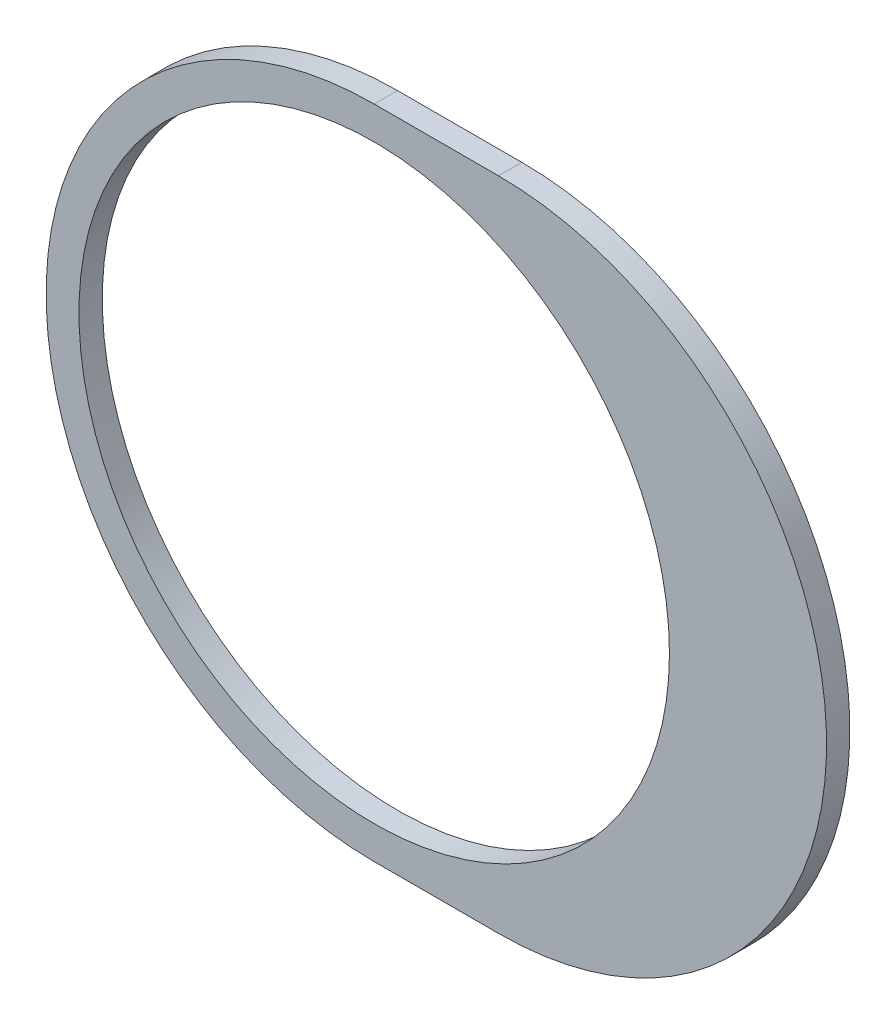
ISO-10303-21;
HEADER;
FILE_DESCRIPTION(('STEP AP214'),'2;1');
FILE_NAME('part.step','',(''),(''),'','','');
FILE_SCHEMA(('AUTOMOTIVE_DESIGN { 1 0 10303 214 1 1 1 1 }'));
ENDSEC;
DATA;
#1=APPLICATION_CONTEXT('core data for automotive mechanical design processes');
#2=APPLICATION_PROTOCOL_DEFINITION('international standard','automotive_design',2000,#1);
#3=PRODUCT_CONTEXT('',#1,'mechanical');
#4=PRODUCT('Part','Part','',(#3));
#5=PRODUCT_RELATED_PRODUCT_CATEGORY('part','',(#4));
#6=PRODUCT_DEFINITION_FORMATION('','',#4);
#7=PRODUCT_DEFINITION_CONTEXT('part definition',#1,'design');
#8=PRODUCT_DEFINITION('design','',#6,#7);
#9=PRODUCT_DEFINITION_SHAPE('','',#8);
#10=(LENGTH_UNIT() NAMED_UNIT(*) SI_UNIT(.MILLI.,.METRE.));
#11=(NAMED_UNIT(*) PLANE_ANGLE_UNIT() SI_UNIT($,.RADIAN.));
#12=(NAMED_UNIT(*) SI_UNIT($,.STERADIAN.) SOLID_ANGLE_UNIT());
#13=UNCERTAINTY_MEASURE_WITH_UNIT(LENGTH_MEASURE(1.E-05),#10,'distance_accuracy_value','');
#14=(GEOMETRIC_REPRESENTATION_CONTEXT(3) GLOBAL_UNCERTAINTY_ASSIGNED_CONTEXT((#13)) GLOBAL_UNIT_ASSIGNED_CONTEXT((#10,
#11,#12)) REPRESENTATION_CONTEXT('',''));
#15=CARTESIAN_POINT('',(0.,0.,0.));
#16=DIRECTION('',(0.,0.,1.));
#17=DIRECTION('',(1.,0.,0.));
#18=AXIS2_PLACEMENT_3D('',#15,#16,#17);
#19=CARTESIAN_POINT('',(79.900018,79.6600134,0.));
#20=DIRECTION('',(0.,1.,0.));
#21=DIRECTION('',(1.,0.,0.));
#22=AXIS2_PLACEMENT_3D('',#19,#20,#21);
#23=PLANE('',#22);
#24=DIRECTION('',(1.,0.,0.));
#25=VECTOR('',#24,1.);
#26=CARTESIAN_POINT('',(79.900018,79.6600134,0.03556));
#27=LINE('',#26,#25);
#28=CARTESIAN_POINT('',(79.900018,79.6600134,0.03556));
#29=VERTEX_POINT('',#28);
#30=CARTESIAN_POINT('',(80.08943596,79.6600134,0.03556));
#31=VERTEX_POINT('',#30);
#32=EDGE_CURVE('E11',#29,#31,#27,.T.);
#33=ORIENTED_EDGE('',*,*,#32,.F.);
#34=DIRECTION('',(0.,0.,1.));
#35=VECTOR('',#34,1.);
#36=CARTESIAN_POINT('',(79.900018,79.6600134,0.));
#37=LINE('',#36,#35);
#38=CARTESIAN_POINT('',(79.900018,79.6600134,0.));
#39=VERTEX_POINT('',#38);
#40=EDGE_CURVE('E24',#39,#29,#37,.T.);
#41=ORIENTED_EDGE('',*,*,#40,.F.);
#42=DIRECTION('',(1.,0.,0.));
#43=VECTOR('',#42,1.);
#44=CARTESIAN_POINT('',(79.900018,79.6600134,0.));
#45=LINE('',#44,#43);
#46=CARTESIAN_POINT('',(80.08943596,79.6600134,0.));
#47=VERTEX_POINT('',#46);
#48=EDGE_CURVE('E96',#39,#47,#45,.T.);
#49=ORIENTED_EDGE('',*,*,#48,.T.);
#50=DIRECTION('',(0.,0.,1.));
#51=VECTOR('',#50,1.);
#52=CARTESIAN_POINT('',(80.08943596,79.6600134,0.));
#53=LINE('',#52,#51);
#54=EDGE_CURVE('E37',#47,#31,#53,.T.);
#55=ORIENTED_EDGE('',*,*,#54,.T.);
#56=EDGE_LOOP('',(#33,#41,#49,#55));
#57=FACE_BOUND('',#56,.T.);
#58=ADVANCED_FACE('F17',(#57),#23,.F.);
#59=CARTESIAN_POINT('',(79.900018,80.1600124,0.));
#60=DIRECTION('',(0.,0.,-1.));
#61=DIRECTION('',(0.,1.,0.));
#62=AXIS2_PLACEMENT_3D('',#59,#60,#61);
#63=CYLINDRICAL_SURFACE('',#62,0.499998999999993);
#64=CARTESIAN_POINT('',(79.900018,80.1600124,0.03556));
#65=DIRECTION('',(0.,0.,1.));
#66=DIRECTION('',(0.,1.,0.));
#67=AXIS2_PLACEMENT_3D('',#64,#65,#66);
#68=CIRCLE('',#67,0.499998999999993);
#69=CARTESIAN_POINT('',(79.900018,80.6600114,0.03556));
#70=VERTEX_POINT('',#69);
#71=EDGE_CURVE('E92',#70,#29,#68,.T.);
#72=ORIENTED_EDGE('',*,*,#71,.F.);
#73=DIRECTION('',(0.,0.,1.));
#74=VECTOR('',#73,1.);
#75=CARTESIAN_POINT('',(79.900018,80.6600114,0.));
#76=LINE('',#75,#74);
#77=CARTESIAN_POINT('',(79.900018,80.6600114,0.));
#78=VERTEX_POINT('',#77);
#79=EDGE_CURVE('E90',#78,#70,#76,.T.);
#80=ORIENTED_EDGE('',*,*,#79,.F.);
#81=CARTESIAN_POINT('',(79.900018,80.1600124,0.));
#82=DIRECTION('',(0.,0.,1.));
#83=DIRECTION('',(0.,1.,0.));
#84=AXIS2_PLACEMENT_3D('',#81,#82,#83);
#85=CIRCLE('',#84,0.499998999999993);
#86=EDGE_CURVE('E88',#78,#39,#85,.T.);
#87=ORIENTED_EDGE('',*,*,#86,.T.);
#88=ORIENTED_EDGE('',*,*,#40,.T.);
#89=EDGE_LOOP('',(#72,#80,#87,#88));
#90=FACE_BOUND('',#89,.T.);
#91=ADVANCED_FACE('F111',(#90),#63,.T.);
#92=CARTESIAN_POINT('',(80.08943596,80.1600124,0.));
#93=DIRECTION('',(0.,0.,-1.));
#94=DIRECTION('',(0.,-1.,0.));
#95=AXIS2_PLACEMENT_3D('',#92,#93,#94);
#96=CYLINDRICAL_SURFACE('',#95,0.499998999999993);
#97=CARTESIAN_POINT('',(80.08943596,80.1600124,0.03556));
#98=DIRECTION('',(0.,0.,1.));
#99=DIRECTION('',(0.,-1.,0.));
#100=AXIS2_PLACEMENT_3D('',#97,#98,#99);
#101=CIRCLE('',#100,0.499998999999993);
#102=CARTESIAN_POINT('',(80.08943596,80.6600114,0.03556));
#103=VERTEX_POINT('',#102);
#104=EDGE_CURVE('E85',#31,#103,#101,.T.);
#105=ORIENTED_EDGE('',*,*,#104,.F.);
#106=ORIENTED_EDGE('',*,*,#54,.F.);
#107=CARTESIAN_POINT('',(80.08943596,80.1600124,0.));
#108=DIRECTION('',(0.,0.,1.));
#109=DIRECTION('',(0.,-1.,0.));
#110=AXIS2_PLACEMENT_3D('',#107,#108,#109);
#111=CIRCLE('',#110,0.499998999999993);
#112=CARTESIAN_POINT('',(80.08943596,80.6600114,0.));
#113=VERTEX_POINT('',#112);
#114=EDGE_CURVE('E82',#47,#113,#111,.T.);
#115=ORIENTED_EDGE('',*,*,#114,.T.);
#116=DIRECTION('',(0.,0.,1.));
#117=VECTOR('',#116,1.);
#118=CARTESIAN_POINT('',(80.08943596,80.6600114,0.));
#119=LINE('',#118,#117);
#120=EDGE_CURVE('E80',#113,#103,#119,.T.);
#121=ORIENTED_EDGE('',*,*,#120,.T.);
#122=EDGE_LOOP('',(#105,#106,#115,#121));
#123=FACE_BOUND('',#122,.T.);
#124=ADVANCED_FACE('F104',(#123),#96,.T.);
#125=CARTESIAN_POINT('',(80.08943596,80.6600114,0.));
#126=DIRECTION('',(0.,-1.,0.));
#127=DIRECTION('',(-1.,0.,0.));
#128=AXIS2_PLACEMENT_3D('',#125,#126,#127);
#129=PLANE('',#128);
#130=DIRECTION('',(-1.,0.,0.));
#131=VECTOR('',#130,1.);
#132=CARTESIAN_POINT('',(80.08943596,80.6600114,0.03556));
#133=LINE('',#132,#131);
#134=EDGE_CURVE('E77',#103,#70,#133,.T.);
#135=ORIENTED_EDGE('',*,*,#134,.F.);
#136=ORIENTED_EDGE('',*,*,#120,.F.);
#137=DIRECTION('',(-1.,0.,0.));
#138=VECTOR('',#137,1.);
#139=CARTESIAN_POINT('',(80.08943596,80.6600114,0.));
#140=LINE('',#139,#138);
#141=EDGE_CURVE('E68',#113,#78,#140,.T.);
#142=ORIENTED_EDGE('',*,*,#141,.T.);
#143=ORIENTED_EDGE('',*,*,#79,.T.);
#144=EDGE_LOOP('',(#135,#136,#142,#143));
#145=FACE_BOUND('',#144,.T.);
#146=ADVANCED_FACE('F110',(#145),#129,.F.);
#147=CARTESIAN_POINT('',(79.900018,80.1600124,0.));
#148=DIRECTION('',(0.,0.,-1.));
#149=DIRECTION('',(1.,0.,0.));
#150=AXIS2_PLACEMENT_3D('',#147,#148,#149);
#151=CYLINDRICAL_SURFACE('',#150,0.4499991);
#152=DIRECTION('',(0.,0.,1.));
#153=VECTOR('',#152,1.);
#154=CARTESIAN_POINT('',(80.3500171,80.1600124,0.));
#155=LINE('',#154,#153);
#156=CARTESIAN_POINT('',(80.3500171,80.1600124,0.));
#157=VERTEX_POINT('',#156);
#158=CARTESIAN_POINT('',(80.3500171,80.1600124,0.03556));
#159=VERTEX_POINT('',#158);
#160=EDGE_CURVE('E62',#157,#159,#155,.T.);
#161=ORIENTED_EDGE('',*,*,#160,.T.);
#162=CARTESIAN_POINT('',(79.900018,80.1600124,0.03556));
#163=DIRECTION('',(0.,0.,1.));
#164=DIRECTION('',(1.,0.,0.));
#165=AXIS2_PLACEMENT_3D('',#162,#163,#164);
#166=CIRCLE('',#165,0.4499991);
#167=EDGE_CURVE('E67',#159,#159,#166,.T.);
#168=ORIENTED_EDGE('',*,*,#167,.T.);
#169=ORIENTED_EDGE('',*,*,#160,.F.);
#170=CARTESIAN_POINT('',(79.900018,80.1600124,0.));
#171=DIRECTION('',(0.,0.,1.));
#172=DIRECTION('',(1.,0.,0.));
#173=AXIS2_PLACEMENT_3D('',#170,#171,#172);
#174=CIRCLE('',#173,0.4499991);
#175=EDGE_CURVE('E65',#157,#157,#174,.T.);
#176=ORIENTED_EDGE('',*,*,#175,.F.);
#177=EDGE_LOOP('',(#161,#168,#169,#176));
#178=FACE_BOUND('',#177,.T.);
#179=ADVANCED_FACE('F64',(#178),#151,.F.);
#180=CARTESIAN_POINT('',(79.900018,79.6600134,0.));
#181=DIRECTION('',(0.,0.,-1.));
#182=DIRECTION('',(-1.,0.,0.));
#183=AXIS2_PLACEMENT_3D('',#180,#181,#182);
#184=PLANE('',#183);
#185=ORIENTED_EDGE('',*,*,#48,.F.);
#186=ORIENTED_EDGE('',*,*,#86,.F.);
#187=ORIENTED_EDGE('',*,*,#141,.F.);
#188=ORIENTED_EDGE('',*,*,#114,.F.);
#189=EDGE_LOOP('',(#185,#186,#187,#188));
#190=FACE_BOUND('',#189,.T.);
#191=ORIENTED_EDGE('',*,*,#175,.T.);
#192=EDGE_LOOP('',(#191));
#193=FACE_BOUND('',#192,.T.);
#194=ADVANCED_FACE('F71',(#190,#193),#184,.T.);
#195=CARTESIAN_POINT('',(79.900018,79.6600134,0.03556));
#196=DIRECTION('',(0.,0.,-1.));
#197=DIRECTION('',(-1.,0.,0.));
#198=AXIS2_PLACEMENT_3D('',#195,#196,#197);
#199=PLANE('',#198);
#200=ORIENTED_EDGE('',*,*,#134,.T.);
#201=ORIENTED_EDGE('',*,*,#71,.T.);
#202=ORIENTED_EDGE('',*,*,#32,.T.);
#203=ORIENTED_EDGE('',*,*,#104,.T.);
#204=EDGE_LOOP('',(#200,#201,#202,#203));
#205=FACE_BOUND('',#204,.T.);
#206=ORIENTED_EDGE('',*,*,#167,.F.);
#207=EDGE_LOOP('',(#206));
#208=FACE_BOUND('',#207,.T.);
#209=ADVANCED_FACE('F107',(#205,#208),#199,.F.);
#210=CLOSED_SHELL('',(#58,#91,#124,#146,#179,#194,#209));
#211=MANIFOLD_SOLID_BREP('B1',#210);
#212=ADVANCED_BREP_SHAPE_REPRESENTATION('',(#18,#211),#14);
#213=SHAPE_DEFINITION_REPRESENTATION(#9,#212);
ENDSEC;
END-ISO-10303-21;
